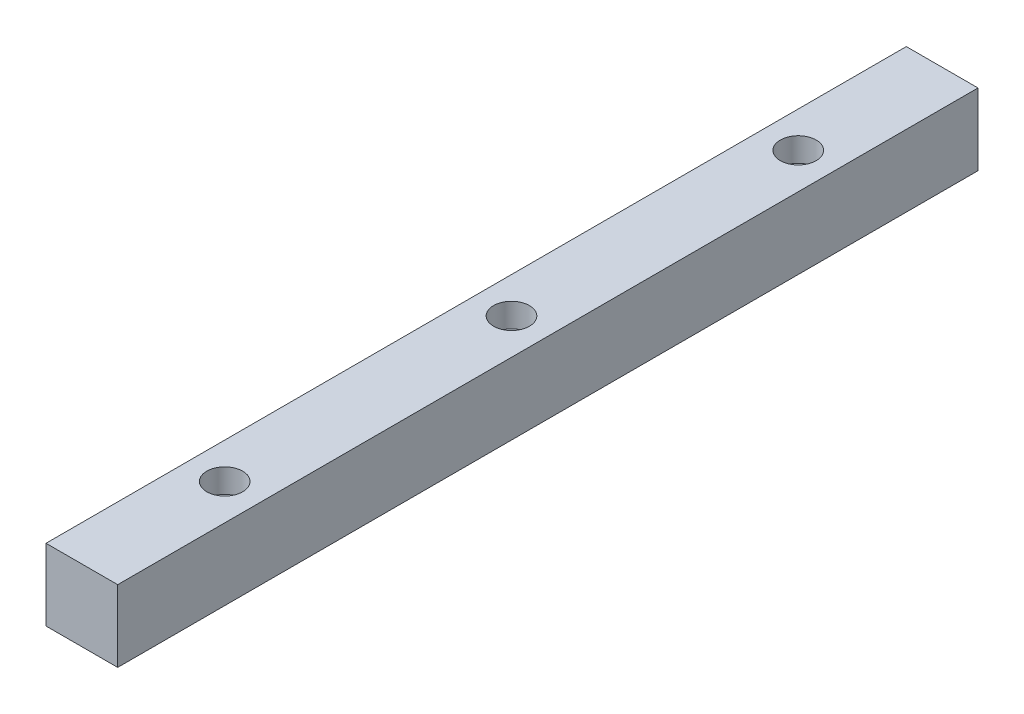
ISO-10303-21;
HEADER;
FILE_DESCRIPTION(('STEP AP214'),'2;1');
FILE_NAME('part.step','',(''),(''),'','','');
FILE_SCHEMA(('AUTOMOTIVE_DESIGN { 1 0 10303 214 1 1 1 1 }'));
ENDSEC;
DATA;
#1=APPLICATION_CONTEXT('core data for automotive mechanical design processes');
#2=APPLICATION_PROTOCOL_DEFINITION('international standard','automotive_design',2000,#1);
#3=PRODUCT_CONTEXT('',#1,'mechanical');
#4=PRODUCT('Part','Part','',(#3));
#5=PRODUCT_RELATED_PRODUCT_CATEGORY('part','',(#4));
#6=PRODUCT_DEFINITION_FORMATION('','',#4);
#7=PRODUCT_DEFINITION_CONTEXT('part definition',#1,'design');
#8=PRODUCT_DEFINITION('design','',#6,#7);
#9=PRODUCT_DEFINITION_SHAPE('','',#8);
#10=(LENGTH_UNIT() NAMED_UNIT(*) SI_UNIT(.MILLI.,.METRE.));
#11=(NAMED_UNIT(*) PLANE_ANGLE_UNIT() SI_UNIT($,.RADIAN.));
#12=(NAMED_UNIT(*) SI_UNIT($,.STERADIAN.) SOLID_ANGLE_UNIT());
#13=UNCERTAINTY_MEASURE_WITH_UNIT(LENGTH_MEASURE(1.E-05),#10,'distance_accuracy_value','');
#14=(GEOMETRIC_REPRESENTATION_CONTEXT(3) GLOBAL_UNCERTAINTY_ASSIGNED_CONTEXT((#13)) GLOBAL_UNIT_ASSIGNED_CONTEXT((#10,
#11,#12)) REPRESENTATION_CONTEXT('',''));
#15=CARTESIAN_POINT('',(0.,0.,0.));
#16=DIRECTION('',(0.,0.,1.));
#17=DIRECTION('',(1.,0.,0.));
#18=AXIS2_PLACEMENT_3D('',#15,#16,#17);
#19=CARTESIAN_POINT('',(-55.0550591515781,15.,-219.219125447559));
#20=DIRECTION('',(0.,-1.,0.));
#21=DIRECTION('',(0.,0.,-1.));
#22=AXIS2_PLACEMENT_3D('',#19,#20,#21);
#23=CYLINDRICAL_SURFACE('',#22,2.00000000000002);
#24=CARTESIAN_POINT('',(-55.0550591515781,0.,-219.219125447559));
#25=DIRECTION('',(0.,1.,0.));
#26=DIRECTION('',(0.,0.,1.));
#27=AXIS2_PLACEMENT_3D('',#24,#25,#26);
#28=CIRCLE('',#27,2.00000000000002);
#29=CARTESIAN_POINT('',(-55.0550591515781,0.,-217.219125447559));
#30=VERTEX_POINT('',#29);
#31=EDGE_CURVE('E103',#30,#30,#28,.T.);
#32=ORIENTED_EDGE('',*,*,#31,.F.);
#33=EDGE_LOOP('',(#32));
#34=FACE_BOUND('',#33,.T.);
#35=CARTESIAN_POINT('',(-55.0550591515781,10.,-219.219125447559));
#36=DIRECTION('',(0.,1.,0.));
#37=DIRECTION('',(0.,0.,1.));
#38=AXIS2_PLACEMENT_3D('',#35,#36,#37);
#39=CIRCLE('',#38,2.00000000000002);
#40=CARTESIAN_POINT('',(-55.0550591515781,10.,-217.219125447559));
#41=VERTEX_POINT('',#40);
#42=EDGE_CURVE('E37',#41,#41,#39,.T.);
#43=ORIENTED_EDGE('',*,*,#42,.T.);
#44=EDGE_LOOP('',(#43));
#45=FACE_BOUND('',#44,.T.);
#46=ADVANCED_FACE('F33',(#34,#45),#23,.F.);
#47=CARTESIAN_POINT('',(-55.0550591515781,15.,-159.219125447559));
#48=DIRECTION('',(0.,-1.,0.));
#49=DIRECTION('',(0.,0.,-1.));
#50=AXIS2_PLACEMENT_3D('',#47,#48,#49);
#51=CYLINDRICAL_SURFACE('',#50,2.);
#52=CARTESIAN_POINT('',(-55.0550591515781,0.,-159.219125447559));
#53=DIRECTION('',(0.,1.,0.));
#54=DIRECTION('',(0.,0.,1.));
#55=AXIS2_PLACEMENT_3D('',#52,#53,#54);
#56=CIRCLE('',#55,2.);
#57=CARTESIAN_POINT('',(-55.0550591515781,0.,-157.219125447559));
#58=VERTEX_POINT('',#57);
#59=EDGE_CURVE('E136',#58,#58,#56,.T.);
#60=ORIENTED_EDGE('',*,*,#59,.F.);
#61=EDGE_LOOP('',(#60));
#62=FACE_BOUND('',#61,.T.);
#63=CARTESIAN_POINT('',(-55.0550591515781,10.,-159.219125447559));
#64=DIRECTION('',(0.,1.,0.));
#65=DIRECTION('',(0.,0.,1.));
#66=AXIS2_PLACEMENT_3D('',#63,#64,#65);
#67=CIRCLE('',#66,2.);
#68=CARTESIAN_POINT('',(-55.0550591515781,10.,-157.219125447559));
#69=VERTEX_POINT('',#68);
#70=EDGE_CURVE('E113',#69,#69,#67,.T.);
#71=ORIENTED_EDGE('',*,*,#70,.T.);
#72=EDGE_LOOP('',(#71));
#73=FACE_BOUND('',#72,.T.);
#74=ADVANCED_FACE('F147',(#62,#73),#51,.F.);
#75=CARTESIAN_POINT('',(-55.0550591515781,15.,-99.2191254475594));
#76=DIRECTION('',(0.,-1.,0.));
#77=DIRECTION('',(0.,0.,-1.));
#78=AXIS2_PLACEMENT_3D('',#75,#76,#77);
#79=CYLINDRICAL_SURFACE('',#78,2.00000000000002);
#80=CARTESIAN_POINT('',(-55.0550591515781,0.,-99.2191254475594));
#81=DIRECTION('',(0.,1.,0.));
#82=DIRECTION('',(0.,0.,1.));
#83=AXIS2_PLACEMENT_3D('',#80,#81,#82);
#84=CIRCLE('',#83,2.00000000000002);
#85=CARTESIAN_POINT('',(-55.0550591515781,0.,-97.2191254475594));
#86=VERTEX_POINT('',#85);
#87=EDGE_CURVE('E111',#86,#86,#84,.T.);
#88=ORIENTED_EDGE('',*,*,#87,.F.);
#89=EDGE_LOOP('',(#88));
#90=FACE_BOUND('',#89,.T.);
#91=CARTESIAN_POINT('',(-55.0550591515781,10.,-99.2191254475594));
#92=DIRECTION('',(0.,1.,0.));
#93=DIRECTION('',(0.,0.,1.));
#94=AXIS2_PLACEMENT_3D('',#91,#92,#93);
#95=CIRCLE('',#94,2.00000000000002);
#96=CARTESIAN_POINT('',(-55.0550591515781,10.,-97.2191254475594));
#97=VERTEX_POINT('',#96);
#98=EDGE_CURVE('E109',#97,#97,#95,.T.);
#99=ORIENTED_EDGE('',*,*,#98,.T.);
#100=EDGE_LOOP('',(#99));
#101=FACE_BOUND('',#100,.T.);
#102=ADVANCED_FACE('F163',(#90,#101),#79,.F.);
#103=CARTESIAN_POINT('',(-47.5550591515782,15.,-249.322347884164));
#104=DIRECTION('',(0.,-1.,0.));
#105=DIRECTION('',(0.,0.,-1.));
#106=AXIS2_PLACEMENT_3D('',#103,#104,#105);
#107=PLANE('',#106);
#108=CARTESIAN_POINT('',(-55.0550591515781,15.,-219.219125447559));
#109=DIRECTION('',(0.,1.,0.));
#110=DIRECTION('',(0.,0.,1.));
#111=AXIS2_PLACEMENT_3D('',#108,#109,#110);
#112=CIRCLE('',#111,3.75000000000001);
#113=CARTESIAN_POINT('',(-55.0550591515781,15.,-215.469125447559));
#114=VERTEX_POINT('',#113);
#115=EDGE_CURVE('E129',#114,#114,#112,.T.);
#116=ORIENTED_EDGE('',*,*,#115,.F.);
#117=EDGE_LOOP('',(#116));
#118=FACE_BOUND('',#117,.T.);
#119=CARTESIAN_POINT('',(-55.0550591515781,15.,-159.219125447559));
#120=DIRECTION('',(0.,1.,0.));
#121=DIRECTION('',(0.,0.,1.));
#122=AXIS2_PLACEMENT_3D('',#119,#120,#121);
#123=CIRCLE('',#122,3.75000000000001);
#124=CARTESIAN_POINT('',(-55.0550591515781,15.,-155.469125447559));
#125=VERTEX_POINT('',#124);
#126=EDGE_CURVE('E122',#125,#125,#123,.T.);
#127=ORIENTED_EDGE('',*,*,#126,.F.);
#128=EDGE_LOOP('',(#127));
#129=FACE_BOUND('',#128,.T.);
#130=CARTESIAN_POINT('',(-55.0550591515781,15.,-99.2191254475594));
#131=DIRECTION('',(0.,1.,0.));
#132=DIRECTION('',(0.,0.,1.));
#133=AXIS2_PLACEMENT_3D('',#130,#131,#132);
#134=CIRCLE('',#133,3.75000000000001);
#135=CARTESIAN_POINT('',(-55.0550591515781,15.,-95.4691254475594));
#136=VERTEX_POINT('',#135);
#137=EDGE_CURVE('E115',#136,#136,#134,.T.);
#138=ORIENTED_EDGE('',*,*,#137,.F.);
#139=EDGE_LOOP('',(#138));
#140=FACE_BOUND('',#139,.T.);
#141=DIRECTION('',(-1.,0.,0.));
#142=VECTOR('',#141,1.);
#143=CARTESIAN_POINT('',(-62.5550591515781,15.,-249.322347884164));
#144=LINE('',#143,#142);
#145=CARTESIAN_POINT('',(-47.5550591515782,15.,-249.322347884164));
#146=VERTEX_POINT('',#145);
#147=CARTESIAN_POINT('',(-62.5550591515781,15.,-249.322347884164));
#148=VERTEX_POINT('',#147);
#149=EDGE_CURVE('E87',#146,#148,#144,.T.);
#150=ORIENTED_EDGE('',*,*,#149,.T.);
#151=DIRECTION('',(0.,0.,1.));
#152=VECTOR('',#151,1.);
#153=CARTESIAN_POINT('',(-62.5550591515781,15.,-249.322347884164));
#154=LINE('',#153,#152);
#155=CARTESIAN_POINT('',(-62.5550591515781,15.,-69.3223478841639));
#156=VERTEX_POINT('',#155);
#157=EDGE_CURVE('E82',#148,#156,#154,.T.);
#158=ORIENTED_EDGE('',*,*,#157,.T.);
#159=DIRECTION('',(1.,0.,0.));
#160=VECTOR('',#159,1.);
#161=CARTESIAN_POINT('',(-62.5550591515781,15.,-69.3223478841639));
#162=LINE('',#161,#160);
#163=CARTESIAN_POINT('',(-47.5550591515781,15.,-69.3223478841639));
#164=VERTEX_POINT('',#163);
#165=EDGE_CURVE('E85',#156,#164,#162,.T.);
#166=ORIENTED_EDGE('',*,*,#165,.T.);
#167=DIRECTION('',(0.,0.,-1.));
#168=VECTOR('',#167,1.);
#169=CARTESIAN_POINT('',(-47.5550591515782,15.,-249.322347884164));
#170=LINE('',#169,#168);
#171=EDGE_CURVE('E52',#164,#146,#170,.T.);
#172=ORIENTED_EDGE('',*,*,#171,.T.);
#173=EDGE_LOOP('',(#150,#158,#166,#172));
#174=FACE_BOUND('',#173,.T.);
#175=ADVANCED_FACE('F83',(#118,#129,#140,#174),#107,.F.);
#176=CARTESIAN_POINT('',(-47.5550591515782,0.,-249.322347884164));
#177=DIRECTION('',(0.,-1.,0.));
#178=DIRECTION('',(0.,0.,-1.));
#179=AXIS2_PLACEMENT_3D('',#176,#177,#178);
#180=PLANE('',#179);
#181=ORIENTED_EDGE('',*,*,#59,.T.);
#182=EDGE_LOOP('',(#181));
#183=FACE_BOUND('',#182,.T.);
#184=DIRECTION('',(-1.,0.,0.));
#185=VECTOR('',#184,1.);
#186=CARTESIAN_POINT('',(-62.5550591515781,0.,-249.322347884164));
#187=LINE('',#186,#185);
#188=CARTESIAN_POINT('',(-47.5550591515782,0.,-249.322347884164));
#189=VERTEX_POINT('',#188);
#190=CARTESIAN_POINT('',(-62.5550591515781,0.,-249.322347884164));
#191=VERTEX_POINT('',#190);
#192=EDGE_CURVE('E100',#189,#191,#187,.T.);
#193=ORIENTED_EDGE('',*,*,#192,.F.);
#194=DIRECTION('',(0.,0.,-1.));
#195=VECTOR('',#194,1.);
#196=CARTESIAN_POINT('',(-47.5550591515782,0.,-249.322347884164));
#197=LINE('',#196,#195);
#198=CARTESIAN_POINT('',(-47.5550591515781,0.,-69.3223478841639));
#199=VERTEX_POINT('',#198);
#200=EDGE_CURVE('E75',#199,#189,#197,.T.);
#201=ORIENTED_EDGE('',*,*,#200,.F.);
#202=DIRECTION('',(1.,0.,0.));
#203=VECTOR('',#202,1.);
#204=CARTESIAN_POINT('',(-62.5550591515781,0.,-69.3223478841639));
#205=LINE('',#204,#203);
#206=CARTESIAN_POINT('',(-62.5550591515781,0.,-69.3223478841639));
#207=VERTEX_POINT('',#206);
#208=EDGE_CURVE('E69',#207,#199,#205,.T.);
#209=ORIENTED_EDGE('',*,*,#208,.F.);
#210=DIRECTION('',(0.,0.,1.));
#211=VECTOR('',#210,1.);
#212=CARTESIAN_POINT('',(-62.5550591515781,0.,-249.322347884164));
#213=LINE('',#212,#211);
#214=EDGE_CURVE('E91',#191,#207,#213,.T.);
#215=ORIENTED_EDGE('',*,*,#214,.F.);
#216=EDGE_LOOP('',(#193,#201,#209,#215));
#217=FACE_BOUND('',#216,.T.);
#218=ORIENTED_EDGE('',*,*,#31,.T.);
#219=EDGE_LOOP('',(#218));
#220=FACE_BOUND('',#219,.T.);
#221=ORIENTED_EDGE('',*,*,#87,.T.);
#222=EDGE_LOOP('',(#221));
#223=FACE_BOUND('',#222,.T.);
#224=ADVANCED_FACE('F142',(#183,#217,#220,#223),#180,.T.);
#225=CARTESIAN_POINT('',(-62.5550591515781,15.,-249.322347884164));
#226=DIRECTION('',(0.,0.,1.));
#227=DIRECTION('',(1.,0.,0.));
#228=AXIS2_PLACEMENT_3D('',#225,#226,#227);
#229=PLANE('',#228);
#230=ORIENTED_EDGE('',*,*,#192,.T.);
#231=DIRECTION('',(0.,-1.,0.));
#232=VECTOR('',#231,1.);
#233=CARTESIAN_POINT('',(-62.5550591515781,15.,-249.322347884164));
#234=LINE('',#233,#232);
#235=EDGE_CURVE('E11',#148,#191,#234,.T.);
#236=ORIENTED_EDGE('',*,*,#235,.F.);
#237=ORIENTED_EDGE('',*,*,#149,.F.);
#238=DIRECTION('',(0.,-1.,0.));
#239=VECTOR('',#238,1.);
#240=CARTESIAN_POINT('',(-47.5550591515782,15.,-249.322347884164));
#241=LINE('',#240,#239);
#242=EDGE_CURVE('E96',#146,#189,#241,.T.);
#243=ORIENTED_EDGE('',*,*,#242,.T.);
#244=EDGE_LOOP('',(#230,#236,#237,#243));
#245=FACE_BOUND('',#244,.T.);
#246=ADVANCED_FACE('F35',(#245),#229,.F.);
#247=CARTESIAN_POINT('',(-62.5550591515781,15.,-249.322347884164));
#248=DIRECTION('',(1.,0.,0.));
#249=DIRECTION('',(0.,0.,-1.));
#250=AXIS2_PLACEMENT_3D('',#247,#248,#249);
#251=PLANE('',#250);
#252=ORIENTED_EDGE('',*,*,#214,.T.);
#253=DIRECTION('',(0.,-1.,0.));
#254=VECTOR('',#253,1.);
#255=CARTESIAN_POINT('',(-62.5550591515781,15.,-69.3223478841639));
#256=LINE('',#255,#254);
#257=EDGE_CURVE('E43',#156,#207,#256,.T.);
#258=ORIENTED_EDGE('',*,*,#257,.F.);
#259=ORIENTED_EDGE('',*,*,#157,.F.);
#260=ORIENTED_EDGE('',*,*,#235,.T.);
#261=EDGE_LOOP('',(#252,#258,#259,#260));
#262=FACE_BOUND('',#261,.T.);
#263=ADVANCED_FACE('F90',(#262),#251,.F.);
#264=CARTESIAN_POINT('',(-62.5550591515781,15.,-69.3223478841639));
#265=DIRECTION('',(0.,0.,-1.));
#266=DIRECTION('',(-1.,0.,0.));
#267=AXIS2_PLACEMENT_3D('',#264,#265,#266);
#268=PLANE('',#267);
#269=ORIENTED_EDGE('',*,*,#208,.T.);
#270=DIRECTION('',(0.,-1.,0.));
#271=VECTOR('',#270,1.);
#272=CARTESIAN_POINT('',(-47.5550591515781,15.,-69.3223478841639));
#273=LINE('',#272,#271);
#274=EDGE_CURVE('E92',#164,#199,#273,.T.);
#275=ORIENTED_EDGE('',*,*,#274,.F.);
#276=ORIENTED_EDGE('',*,*,#165,.F.);
#277=ORIENTED_EDGE('',*,*,#257,.T.);
#278=EDGE_LOOP('',(#269,#275,#276,#277));
#279=FACE_BOUND('',#278,.T.);
#280=ADVANCED_FACE('F94',(#279),#268,.F.);
#281=CARTESIAN_POINT('',(-47.5550591515782,15.,-249.322347884164));
#282=DIRECTION('',(-1.,0.,0.));
#283=DIRECTION('',(0.,0.,1.));
#284=AXIS2_PLACEMENT_3D('',#281,#282,#283);
#285=PLANE('',#284);
#286=ORIENTED_EDGE('',*,*,#200,.T.);
#287=ORIENTED_EDGE('',*,*,#242,.F.);
#288=ORIENTED_EDGE('',*,*,#171,.F.);
#289=ORIENTED_EDGE('',*,*,#274,.T.);
#290=EDGE_LOOP('',(#286,#287,#288,#289));
#291=FACE_BOUND('',#290,.T.);
#292=ADVANCED_FACE('F172',(#291),#285,.F.);
#293=CARTESIAN_POINT('',(-55.0550591515781,10.,-99.2191254475594));
#294=DIRECTION('',(0.,1.,0.));
#295=DIRECTION('',(0.,0.,1.));
#296=AXIS2_PLACEMENT_3D('',#293,#294,#295);
#297=CYLINDRICAL_SURFACE('',#296,3.75000000000001);
#298=CARTESIAN_POINT('',(-55.0550591515781,10.,-99.2191254475594));
#299=DIRECTION('',(0.,1.,0.));
#300=DIRECTION('',(0.,0.,1.));
#301=AXIS2_PLACEMENT_3D('',#298,#299,#300);
#302=CIRCLE('',#301,3.75000000000001);
#303=CARTESIAN_POINT('',(-55.0550591515781,10.,-95.4691254475594));
#304=VERTEX_POINT('',#303);
#305=EDGE_CURVE('E112',#304,#304,#302,.T.);
#306=ORIENTED_EDGE('',*,*,#305,.F.);
#307=EDGE_LOOP('',(#306));
#308=FACE_BOUND('',#307,.T.);
#309=ORIENTED_EDGE('',*,*,#137,.T.);
#310=EDGE_LOOP('',(#309));
#311=FACE_BOUND('',#310,.T.);
#312=ADVANCED_FACE('F169',(#308,#311),#297,.F.);
#313=CARTESIAN_POINT('',(-55.0550591515781,10.,-99.2191254475594));
#314=DIRECTION('',(0.,1.,0.));
#315=DIRECTION('',(0.,0.,1.));
#316=AXIS2_PLACEMENT_3D('',#313,#314,#315);
#317=PLANE('',#316);
#318=ORIENTED_EDGE('',*,*,#98,.F.);
#319=EDGE_LOOP('',(#318));
#320=FACE_BOUND('',#319,.T.);
#321=ORIENTED_EDGE('',*,*,#305,.T.);
#322=EDGE_LOOP('',(#321));
#323=FACE_BOUND('',#322,.T.);
#324=ADVANCED_FACE('F171',(#320,#323),#317,.T.);
#325=CARTESIAN_POINT('',(-55.0550591515781,10.,-159.219125447559));
#326=DIRECTION('',(0.,1.,0.));
#327=DIRECTION('',(0.,0.,1.));
#328=AXIS2_PLACEMENT_3D('',#325,#326,#327);
#329=CYLINDRICAL_SURFACE('',#328,3.75000000000001);
#330=CARTESIAN_POINT('',(-55.0550591515781,10.,-159.219125447559));
#331=DIRECTION('',(0.,1.,0.));
#332=DIRECTION('',(0.,0.,1.));
#333=AXIS2_PLACEMENT_3D('',#330,#331,#332);
#334=CIRCLE('',#333,3.75000000000001);
#335=CARTESIAN_POINT('',(-55.0550591515781,10.,-155.469125447559));
#336=VERTEX_POINT('',#335);
#337=EDGE_CURVE('E116',#336,#336,#334,.T.);
#338=ORIENTED_EDGE('',*,*,#337,.F.);
#339=EDGE_LOOP('',(#338));
#340=FACE_BOUND('',#339,.T.);
#341=ORIENTED_EDGE('',*,*,#126,.T.);
#342=EDGE_LOOP('',(#341));
#343=FACE_BOUND('',#342,.T.);
#344=ADVANCED_FACE('F179',(#340,#343),#329,.F.);
#345=CARTESIAN_POINT('',(-55.0550591515781,10.,-159.219125447559));
#346=DIRECTION('',(0.,1.,0.));
#347=DIRECTION('',(0.,0.,1.));
#348=AXIS2_PLACEMENT_3D('',#345,#346,#347);
#349=PLANE('',#348);
#350=ORIENTED_EDGE('',*,*,#70,.F.);
#351=EDGE_LOOP('',(#350));
#352=FACE_BOUND('',#351,.T.);
#353=ORIENTED_EDGE('',*,*,#337,.T.);
#354=EDGE_LOOP('',(#353));
#355=FACE_BOUND('',#354,.T.);
#356=ADVANCED_FACE('F270',(#352,#355),#349,.T.);
#357=CARTESIAN_POINT('',(-55.0550591515781,10.,-219.219125447559));
#358=DIRECTION('',(0.,1.,0.));
#359=DIRECTION('',(0.,0.,1.));
#360=AXIS2_PLACEMENT_3D('',#357,#358,#359);
#361=CYLINDRICAL_SURFACE('',#360,3.75000000000001);
#362=CARTESIAN_POINT('',(-55.0550591515781,10.,-219.219125447559));
#363=DIRECTION('',(0.,1.,0.));
#364=DIRECTION('',(0.,0.,1.));
#365=AXIS2_PLACEMENT_3D('',#362,#363,#364);
#366=CIRCLE('',#365,3.75000000000001);
#367=CARTESIAN_POINT('',(-55.0550591515781,10.,-215.469125447559));
#368=VERTEX_POINT('',#367);
#369=EDGE_CURVE('E152',#368,#368,#366,.T.);
#370=ORIENTED_EDGE('',*,*,#369,.F.);
#371=EDGE_LOOP('',(#370));
#372=FACE_BOUND('',#371,.T.);
#373=ORIENTED_EDGE('',*,*,#115,.T.);
#374=EDGE_LOOP('',(#373));
#375=FACE_BOUND('',#374,.T.);
#376=ADVANCED_FACE('F159',(#372,#375),#361,.F.);
#377=CARTESIAN_POINT('',(-55.0550591515781,10.,-219.219125447559));
#378=DIRECTION('',(0.,1.,0.));
#379=DIRECTION('',(0.,0.,1.));
#380=AXIS2_PLACEMENT_3D('',#377,#378,#379);
#381=PLANE('',#380);
#382=ORIENTED_EDGE('',*,*,#42,.F.);
#383=EDGE_LOOP('',(#382));
#384=FACE_BOUND('',#383,.T.);
#385=ORIENTED_EDGE('',*,*,#369,.T.);
#386=EDGE_LOOP('',(#385));
#387=FACE_BOUND('',#386,.T.);
#388=ADVANCED_FACE('F286',(#384,#387),#381,.T.);
#389=CLOSED_SHELL('',(#46,#74,#102,#175,#224,#246,#263,#280,#292,#312,#324,#344,#356,#376,#388));
#390=MANIFOLD_SOLID_BREP('B2',#389);
#391=ADVANCED_BREP_SHAPE_REPRESENTATION('',(#18,#390),#14);
#392=SHAPE_DEFINITION_REPRESENTATION(#9,#391);
ENDSEC;
END-ISO-10303-21;
